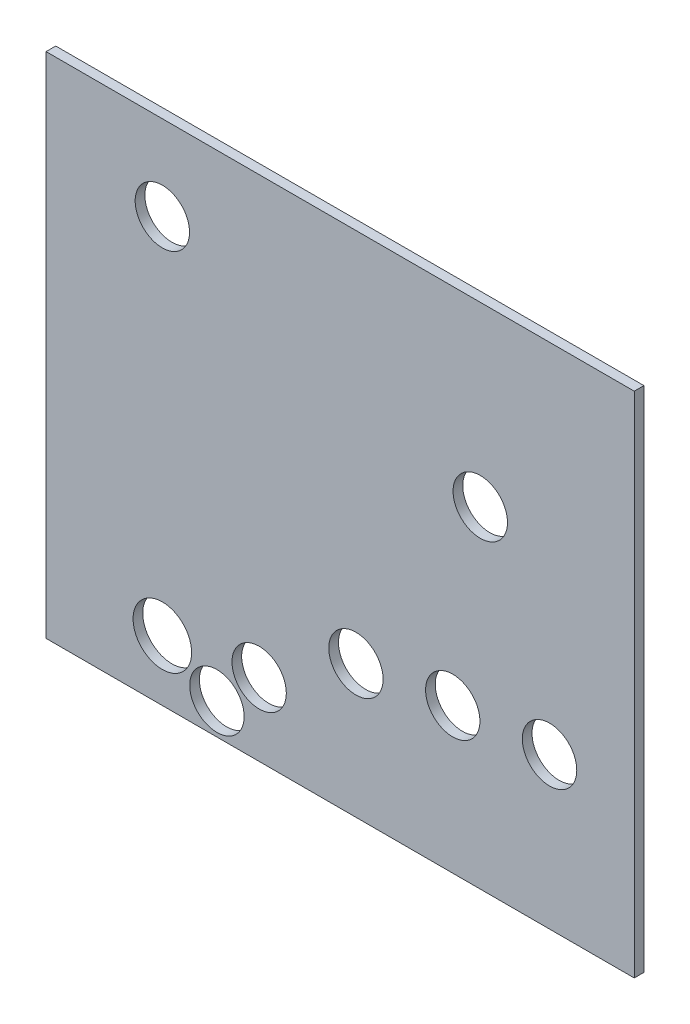
ISO-10303-21;
HEADER;
FILE_DESCRIPTION(('STEP AP214'),'2;1');
FILE_NAME('part.step','',(''),(''),'','','');
FILE_SCHEMA(('AUTOMOTIVE_DESIGN { 1 0 10303 214 1 1 1 1 }'));
ENDSEC;
DATA;
#1=APPLICATION_CONTEXT('core data for automotive mechanical design processes');
#2=APPLICATION_PROTOCOL_DEFINITION('international standard','automotive_design',2000,#1);
#3=PRODUCT_CONTEXT('',#1,'mechanical');
#4=PRODUCT('Part','Part','',(#3));
#5=PRODUCT_RELATED_PRODUCT_CATEGORY('part','',(#4));
#6=PRODUCT_DEFINITION_FORMATION('','',#4);
#7=PRODUCT_DEFINITION_CONTEXT('part definition',#1,'design');
#8=PRODUCT_DEFINITION('design','',#6,#7);
#9=PRODUCT_DEFINITION_SHAPE('','',#8);
#10=(LENGTH_UNIT() NAMED_UNIT(*) SI_UNIT(.MILLI.,.METRE.));
#11=(NAMED_UNIT(*) PLANE_ANGLE_UNIT() SI_UNIT($,.RADIAN.));
#12=(NAMED_UNIT(*) SI_UNIT($,.STERADIAN.) SOLID_ANGLE_UNIT());
#13=UNCERTAINTY_MEASURE_WITH_UNIT(LENGTH_MEASURE(1.E-05),#10,'distance_accuracy_value','');
#14=(GEOMETRIC_REPRESENTATION_CONTEXT(3) GLOBAL_UNCERTAINTY_ASSIGNED_CONTEXT((#13)) GLOBAL_UNIT_ASSIGNED_CONTEXT((#10,
#11,#12)) REPRESENTATION_CONTEXT('',''));
#15=CARTESIAN_POINT('',(0.,0.,0.));
#16=DIRECTION('',(0.,0.,1.));
#17=DIRECTION('',(1.,0.,0.));
#18=AXIS2_PLACEMENT_3D('',#15,#16,#17);
#19=CARTESIAN_POINT('',(0.,-173.714359578953,5.08));
#20=DIRECTION('',(0.,1.,0.));
#21=DIRECTION('',(-1.,0.,0.));
#22=AXIS2_PLACEMENT_3D('',#19,#20,#21);
#23=PLANE('',#22);
#24=DIRECTION('',(1.,0.,0.));
#25=VECTOR('',#24,1.);
#26=CARTESIAN_POINT('',(0.,-173.714359578953,0.));
#27=LINE('',#26,#25);
#28=CARTESIAN_POINT('',(-227.868525816882,-173.714359578953,0.));
#29=VERTEX_POINT('',#28);
#30=CARTESIAN_POINT('',(80.8024486752066,-173.714359578953,0.));
#31=VERTEX_POINT('',#30);
#32=EDGE_CURVE('E131',#29,#31,#27,.T.);
#33=ORIENTED_EDGE('',*,*,#32,.T.);
#34=DIRECTION('',(0.,0.,-1.));
#35=VECTOR('',#34,1.);
#36=CARTESIAN_POINT('',(80.8024486752066,-173.714359578953,5.08));
#37=LINE('',#36,#35);
#38=CARTESIAN_POINT('',(80.8024486752066,-173.714359578953,5.08));
#39=VERTEX_POINT('',#38);
#40=EDGE_CURVE('E11',#39,#31,#37,.T.);
#41=ORIENTED_EDGE('',*,*,#40,.F.);
#42=DIRECTION('',(1.,0.,0.));
#43=VECTOR('',#42,1.);
#44=CARTESIAN_POINT('',(0.,-173.714359578953,5.08));
#45=LINE('',#44,#43);
#46=CARTESIAN_POINT('',(-227.868525816882,-173.714359578953,5.08));
#47=VERTEX_POINT('',#46);
#48=EDGE_CURVE('E95',#47,#39,#45,.T.);
#49=ORIENTED_EDGE('',*,*,#48,.F.);
#50=DIRECTION('',(0.,0.,-1.));
#51=VECTOR('',#50,1.);
#52=CARTESIAN_POINT('',(-227.868525816882,-173.714359578953,5.08));
#53=LINE('',#52,#51);
#54=EDGE_CURVE('E103',#47,#29,#53,.T.);
#55=ORIENTED_EDGE('',*,*,#54,.T.);
#56=EDGE_LOOP('',(#33,#41,#49,#55));
#57=FACE_BOUND('',#56,.T.);
#58=ADVANCED_FACE('F43',(#57),#23,.F.);
#59=CARTESIAN_POINT('',(80.8024486752066,0.,5.08));
#60=DIRECTION('',(-1.,0.,0.));
#61=DIRECTION('',(0.,0.,1.));
#62=AXIS2_PLACEMENT_3D('',#59,#60,#61);
#63=PLANE('',#62);
#64=DIRECTION('',(0.,1.,0.));
#65=VECTOR('',#64,1.);
#66=CARTESIAN_POINT('',(80.8024486752066,0.,0.));
#67=LINE('',#66,#65);
#68=CARTESIAN_POINT('',(80.8024486752066,92.9856404210473,0.));
#69=VERTEX_POINT('',#68);
#70=EDGE_CURVE('E99',#31,#69,#67,.T.);
#71=ORIENTED_EDGE('',*,*,#70,.T.);
#72=DIRECTION('',(0.,0.,-1.));
#73=VECTOR('',#72,1.);
#74=CARTESIAN_POINT('',(80.8024486752066,92.9856404210473,5.08));
#75=LINE('',#74,#73);
#76=CARTESIAN_POINT('',(80.8024486752066,92.9856404210473,5.08));
#77=VERTEX_POINT('',#76);
#78=EDGE_CURVE('E52',#77,#69,#75,.T.);
#79=ORIENTED_EDGE('',*,*,#78,.F.);
#80=DIRECTION('',(0.,1.,0.));
#81=VECTOR('',#80,1.);
#82=CARTESIAN_POINT('',(80.8024486752066,0.,5.08));
#83=LINE('',#82,#81);
#84=EDGE_CURVE('E90',#39,#77,#83,.T.);
#85=ORIENTED_EDGE('',*,*,#84,.F.);
#86=ORIENTED_EDGE('',*,*,#40,.T.);
#87=EDGE_LOOP('',(#71,#79,#85,#86));
#88=FACE_BOUND('',#87,.T.);
#89=ADVANCED_FACE('F98',(#88),#63,.F.);
#90=CARTESIAN_POINT('',(0.,92.9856404210473,5.08));
#91=DIRECTION('',(0.,-1.,0.));
#92=DIRECTION('',(0.,0.,-1.));
#93=AXIS2_PLACEMENT_3D('',#90,#91,#92);
#94=PLANE('',#93);
#95=DIRECTION('',(-1.,0.,0.));
#96=VECTOR('',#95,1.);
#97=CARTESIAN_POINT('',(0.,92.9856404210473,0.));
#98=LINE('',#97,#96);
#99=CARTESIAN_POINT('',(-227.868525816882,92.9856404210473,0.));
#100=VERTEX_POINT('',#99);
#101=EDGE_CURVE('E77',#69,#100,#98,.T.);
#102=ORIENTED_EDGE('',*,*,#101,.T.);
#103=DIRECTION('',(0.,0.,-1.));
#104=VECTOR('',#103,1.);
#105=CARTESIAN_POINT('',(-227.868525816882,92.9856404210473,5.08));
#106=LINE('',#105,#104);
#107=CARTESIAN_POINT('',(-227.868525816882,92.9856404210473,5.08));
#108=VERTEX_POINT('',#107);
#109=EDGE_CURVE('E100',#108,#100,#106,.T.);
#110=ORIENTED_EDGE('',*,*,#109,.F.);
#111=DIRECTION('',(-1.,0.,0.));
#112=VECTOR('',#111,1.);
#113=CARTESIAN_POINT('',(0.,92.9856404210473,5.08));
#114=LINE('',#113,#112);
#115=EDGE_CURVE('E93',#77,#108,#114,.T.);
#116=ORIENTED_EDGE('',*,*,#115,.F.);
#117=ORIENTED_EDGE('',*,*,#78,.T.);
#118=EDGE_LOOP('',(#102,#110,#116,#117));
#119=FACE_BOUND('',#118,.T.);
#120=ADVANCED_FACE('F101',(#119),#94,.F.);
#121=CARTESIAN_POINT('',(0.,0.,5.08));
#122=DIRECTION('',(0.,0.,-1.));
#123=DIRECTION('',(-1.,0.,0.));
#124=AXIS2_PLACEMENT_3D('',#121,#122,#123);
#125=CYLINDRICAL_SURFACE('',#124,14.2875);
#126=CARTESIAN_POINT('',(0.,0.,5.08));
#127=DIRECTION('',(0.,0.,1.));
#128=DIRECTION('',(1.,0.,0.));
#129=AXIS2_PLACEMENT_3D('',#126,#127,#128);
#130=CIRCLE('',#129,14.2875);
#131=CARTESIAN_POINT('',(14.2875,0.,5.08));
#132=VERTEX_POINT('',#131);
#133=EDGE_CURVE('E144',#132,#132,#130,.T.);
#134=ORIENTED_EDGE('',*,*,#133,.T.);
#135=EDGE_LOOP('',(#134));
#136=FACE_BOUND('',#135,.T.);
#137=CARTESIAN_POINT('',(0.,0.,0.));
#138=DIRECTION('',(0.,0.,1.));
#139=DIRECTION('',(1.,0.,0.));
#140=AXIS2_PLACEMENT_3D('',#137,#138,#139);
#141=CIRCLE('',#140,14.2875);
#142=CARTESIAN_POINT('',(14.2875,0.,0.));
#143=VERTEX_POINT('',#142);
#144=EDGE_CURVE('E128',#143,#143,#141,.T.);
#145=ORIENTED_EDGE('',*,*,#144,.F.);
#146=EDGE_LOOP('',(#145));
#147=FACE_BOUND('',#146,.T.);
#148=ADVANCED_FACE('F188',(#136,#147),#125,.F.);
#149=CARTESIAN_POINT('',(-138.20185945543,-157.325049094457,5.08));
#150=DIRECTION('',(0.,0.,-1.));
#151=DIRECTION('',(-1.,0.,0.));
#152=AXIS2_PLACEMENT_3D('',#149,#150,#151);
#153=CYLINDRICAL_SURFACE('',#152,14.2875);
#154=CARTESIAN_POINT('',(-138.20185945543,-157.325049094457,5.08));
#155=DIRECTION('',(0.,0.,1.));
#156=DIRECTION('',(1.,0.,0.));
#157=AXIS2_PLACEMENT_3D('',#154,#155,#156);
#158=CIRCLE('',#157,14.2875);
#159=CARTESIAN_POINT('',(-123.91435945543,-157.325049094457,5.08));
#160=VERTEX_POINT('',#159);
#161=EDGE_CURVE('E146',#160,#160,#158,.T.);
#162=ORIENTED_EDGE('',*,*,#161,.T.);
#163=EDGE_LOOP('',(#162));
#164=FACE_BOUND('',#163,.T.);
#165=CARTESIAN_POINT('',(-138.20185945543,-157.325049094457,0.));
#166=DIRECTION('',(0.,0.,1.));
#167=DIRECTION('',(1.,0.,0.));
#168=AXIS2_PLACEMENT_3D('',#165,#166,#167);
#169=CIRCLE('',#168,14.2875);
#170=CARTESIAN_POINT('',(-123.91435945543,-157.325049094457,0.));
#171=VERTEX_POINT('',#170);
#172=EDGE_CURVE('E125',#171,#171,#169,.T.);
#173=ORIENTED_EDGE('',*,*,#172,.F.);
#174=EDGE_LOOP('',(#173));
#175=FACE_BOUND('',#174,.T.);
#176=ADVANCED_FACE('F191',(#164,#175),#153,.F.);
#177=CARTESIAN_POINT('',(-166.847551324245,48.5356404208762,5.08));
#178=DIRECTION('',(0.,0.,-1.));
#179=DIRECTION('',(-1.,0.,0.));
#180=AXIS2_PLACEMENT_3D('',#177,#178,#179);
#181=CYLINDRICAL_SURFACE('',#180,14.2621000003079);
#182=CARTESIAN_POINT('',(-166.847551324245,48.5356404208762,5.08));
#183=DIRECTION('',(0.,0.,1.));
#184=DIRECTION('',(1.,0.,0.));
#185=AXIS2_PLACEMENT_3D('',#182,#183,#184);
#186=CIRCLE('',#185,14.2621000003079);
#187=CARTESIAN_POINT('',(-152.585451323937,48.5356404208762,5.08));
#188=VERTEX_POINT('',#187);
#189=EDGE_CURVE('E151',#188,#188,#186,.T.);
#190=ORIENTED_EDGE('',*,*,#189,.T.);
#191=EDGE_LOOP('',(#190));
#192=FACE_BOUND('',#191,.T.);
#193=CARTESIAN_POINT('',(-166.847551324245,48.5356404208762,0.));
#194=DIRECTION('',(0.,0.,1.));
#195=DIRECTION('',(1.,0.,0.));
#196=AXIS2_PLACEMENT_3D('',#193,#194,#195);
#197=CIRCLE('',#196,14.2621000003079);
#198=CARTESIAN_POINT('',(-152.585451323937,48.5356404208762,0.));
#199=VERTEX_POINT('',#198);
#200=EDGE_CURVE('E122',#199,#199,#197,.T.);
#201=ORIENTED_EDGE('',*,*,#200,.F.);
#202=EDGE_LOOP('',(#201));
#203=FACE_BOUND('',#202,.T.);
#204=ADVANCED_FACE('F212',(#192,#203),#181,.F.);
#205=CARTESIAN_POINT('',(-166.847551324439,-141.964359578953,5.08));
#206=DIRECTION('',(0.,0.,-1.));
#207=DIRECTION('',(-1.,0.,0.));
#208=AXIS2_PLACEMENT_3D('',#205,#206,#207);
#209=CYLINDRICAL_SURFACE('',#208,15.365901375561);
#210=CARTESIAN_POINT('',(-166.847551324439,-141.964359578953,5.08));
#211=DIRECTION('',(0.,0.,1.));
#212=DIRECTION('',(1.,0.,0.));
#213=AXIS2_PLACEMENT_3D('',#210,#211,#212);
#214=CIRCLE('',#213,15.365901375561);
#215=CARTESIAN_POINT('',(-151.481649948878,-141.964359578953,5.08));
#216=VERTEX_POINT('',#215);
#217=EDGE_CURVE('E154',#216,#216,#214,.T.);
#218=ORIENTED_EDGE('',*,*,#217,.T.);
#219=EDGE_LOOP('',(#218));
#220=FACE_BOUND('',#219,.T.);
#221=CARTESIAN_POINT('',(-166.847551324439,-141.964359578953,0.));
#222=DIRECTION('',(0.,0.,1.));
#223=DIRECTION('',(1.,0.,0.));
#224=AXIS2_PLACEMENT_3D('',#221,#222,#223);
#225=CIRCLE('',#224,15.365901375561);
#226=CARTESIAN_POINT('',(-151.481649948878,-141.964359578953,0.));
#227=VERTEX_POINT('',#226);
#228=EDGE_CURVE('E119',#227,#227,#225,.T.);
#229=ORIENTED_EDGE('',*,*,#228,.F.);
#230=EDGE_LOOP('',(#229));
#231=FACE_BOUND('',#230,.T.);
#232=ADVANCED_FACE('F216',(#220,#231),#209,.F.);
#233=CARTESIAN_POINT('',(-116.047551324426,-135.614359579057,5.08));
#234=DIRECTION('',(0.,0.,-1.));
#235=DIRECTION('',(-1.,0.,0.));
#236=AXIS2_PLACEMENT_3D('',#233,#234,#235);
#237=CYLINDRICAL_SURFACE('',#236,14.262100000127);
#238=CARTESIAN_POINT('',(-116.047551324426,-135.614359579057,5.08));
#239=DIRECTION('',(0.,0.,1.));
#240=DIRECTION('',(1.,0.,0.));
#241=AXIS2_PLACEMENT_3D('',#238,#239,#240);
#242=CIRCLE('',#241,14.262100000127);
#243=CARTESIAN_POINT('',(-101.785451324299,-135.614359579057,5.08));
#244=VERTEX_POINT('',#243);
#245=EDGE_CURVE('E157',#244,#244,#242,.T.);
#246=ORIENTED_EDGE('',*,*,#245,.T.);
#247=EDGE_LOOP('',(#246));
#248=FACE_BOUND('',#247,.T.);
#249=CARTESIAN_POINT('',(-116.047551324426,-135.614359579057,0.));
#250=DIRECTION('',(0.,0.,1.));
#251=DIRECTION('',(1.,0.,0.));
#252=AXIS2_PLACEMENT_3D('',#249,#250,#251);
#253=CIRCLE('',#252,14.262100000127);
#254=CARTESIAN_POINT('',(-101.785451324299,-135.614359579057,0.));
#255=VERTEX_POINT('',#254);
#256=EDGE_CURVE('E116',#255,#255,#253,.T.);
#257=ORIENTED_EDGE('',*,*,#256,.F.);
#258=EDGE_LOOP('',(#257));
#259=FACE_BOUND('',#258,.T.);
#260=ADVANCED_FACE('F220',(#248,#259),#237,.F.);
#261=CARTESIAN_POINT('',(-65.2475513245231,-103.864359579092,5.08));
#262=DIRECTION('',(0.,0.,-1.));
#263=DIRECTION('',(-1.,0.,0.));
#264=AXIS2_PLACEMENT_3D('',#261,#262,#263);
#265=CYLINDRICAL_SURFACE('',#264,14.2621000000297);
#266=CARTESIAN_POINT('',(-65.2475513245231,-103.864359579092,5.08));
#267=DIRECTION('',(0.,0.,1.));
#268=DIRECTION('',(1.,0.,0.));
#269=AXIS2_PLACEMENT_3D('',#266,#267,#268);
#270=CIRCLE('',#269,14.2621000000297);
#271=CARTESIAN_POINT('',(-50.9854513244933,-103.864359579092,5.08));
#272=VERTEX_POINT('',#271);
#273=EDGE_CURVE('E160',#272,#272,#270,.T.);
#274=ORIENTED_EDGE('',*,*,#273,.T.);
#275=EDGE_LOOP('',(#274));
#276=FACE_BOUND('',#275,.T.);
#277=CARTESIAN_POINT('',(-65.2475513245231,-103.864359579092,0.));
#278=DIRECTION('',(0.,0.,1.));
#279=DIRECTION('',(1.,0.,0.));
#280=AXIS2_PLACEMENT_3D('',#277,#278,#279);
#281=CIRCLE('',#280,14.2621000000297);
#282=CARTESIAN_POINT('',(-50.9854513244933,-103.864359579092,0.));
#283=VERTEX_POINT('',#282);
#284=EDGE_CURVE('E113',#283,#283,#281,.T.);
#285=ORIENTED_EDGE('',*,*,#284,.F.);
#286=EDGE_LOOP('',(#285));
#287=FACE_BOUND('',#286,.T.);
#288=ADVANCED_FACE('F224',(#276,#287),#265,.F.);
#289=CARTESIAN_POINT('',(-14.4475513245528,-97.5143595788538,5.08));
#290=DIRECTION('',(0.,0.,-1.));
#291=DIRECTION('',(-1.,0.,0.));
#292=AXIS2_PLACEMENT_3D('',#289,#290,#291);
#293=CYLINDRICAL_SURFACE('',#292,14.2621);
#294=CARTESIAN_POINT('',(-14.4475513245528,-97.5143595788538,5.08));
#295=DIRECTION('',(0.,0.,1.));
#296=DIRECTION('',(1.,0.,0.));
#297=AXIS2_PLACEMENT_3D('',#294,#295,#296);
#298=CIRCLE('',#297,14.2621);
#299=CARTESIAN_POINT('',(-0.185451324552794,-97.5143595788538,5.08));
#300=VERTEX_POINT('',#299);
#301=EDGE_CURVE('E163',#300,#300,#298,.T.);
#302=ORIENTED_EDGE('',*,*,#301,.T.);
#303=EDGE_LOOP('',(#302));
#304=FACE_BOUND('',#303,.T.);
#305=CARTESIAN_POINT('',(-14.4475513245528,-97.5143595788538,0.));
#306=DIRECTION('',(0.,0.,1.));
#307=DIRECTION('',(1.,0.,0.));
#308=AXIS2_PLACEMENT_3D('',#305,#306,#307);
#309=CIRCLE('',#308,14.2621);
#310=CARTESIAN_POINT('',(-0.185451324552794,-97.5143595788538,0.));
#311=VERTEX_POINT('',#310);
#312=EDGE_CURVE('E110',#311,#311,#309,.T.);
#313=ORIENTED_EDGE('',*,*,#312,.F.);
#314=EDGE_LOOP('',(#313));
#315=FACE_BOUND('',#314,.T.);
#316=ADVANCED_FACE('F227',(#304,#315),#293,.F.);
#317=CARTESIAN_POINT('',(36.3524486754472,-94.3893206007822,5.08));
#318=DIRECTION('',(0.,0.,-1.));
#319=DIRECTION('',(-1.,0.,0.));
#320=AXIS2_PLACEMENT_3D('',#317,#318,#319);
#321=CYLINDRICAL_SURFACE('',#320,14.2875);
#322=CARTESIAN_POINT('',(36.3524486754472,-94.3893206007822,5.08));
#323=DIRECTION('',(0.,0.,1.));
#324=DIRECTION('',(1.,0.,0.));
#325=AXIS2_PLACEMENT_3D('',#322,#323,#324);
#326=CIRCLE('',#325,14.2875);
#327=CARTESIAN_POINT('',(50.6399486754472,-94.3893206007822,5.08));
#328=VERTEX_POINT('',#327);
#329=EDGE_CURVE('E137',#328,#328,#326,.T.);
#330=ORIENTED_EDGE('',*,*,#329,.T.);
#331=EDGE_LOOP('',(#330));
#332=FACE_BOUND('',#331,.T.);
#333=CARTESIAN_POINT('',(36.3524486754472,-94.3893206007822,0.));
#334=DIRECTION('',(0.,0.,1.));
#335=DIRECTION('',(1.,0.,0.));
#336=AXIS2_PLACEMENT_3D('',#333,#334,#335);
#337=CIRCLE('',#336,14.2875);
#338=CARTESIAN_POINT('',(50.6399486754472,-94.3893206007822,0.));
#339=VERTEX_POINT('',#338);
#340=EDGE_CURVE('E107',#339,#339,#337,.T.);
#341=ORIENTED_EDGE('',*,*,#340,.F.);
#342=EDGE_LOOP('',(#341));
#343=FACE_BOUND('',#342,.T.);
#344=ADVANCED_FACE('F45',(#332,#343),#321,.F.);
#345=CARTESIAN_POINT('',(-227.868525816882,0.,5.08));
#346=DIRECTION('',(1.,0.,0.));
#347=DIRECTION('',(0.,0.,-1.));
#348=AXIS2_PLACEMENT_3D('',#345,#346,#347);
#349=PLANE('',#348);
#350=DIRECTION('',(0.,-1.,0.));
#351=VECTOR('',#350,1.);
#352=CARTESIAN_POINT('',(-227.868525816882,0.,0.));
#353=LINE('',#352,#351);
#354=EDGE_CURVE('E83',#100,#29,#353,.T.);
#355=ORIENTED_EDGE('',*,*,#354,.T.);
#356=ORIENTED_EDGE('',*,*,#54,.F.);
#357=DIRECTION('',(0.,-1.,0.));
#358=VECTOR('',#357,1.);
#359=CARTESIAN_POINT('',(-227.868525816882,0.,5.08));
#360=LINE('',#359,#358);
#361=EDGE_CURVE('E60',#108,#47,#360,.T.);
#362=ORIENTED_EDGE('',*,*,#361,.F.);
#363=ORIENTED_EDGE('',*,*,#109,.T.);
#364=EDGE_LOOP('',(#355,#356,#362,#363));
#365=FACE_BOUND('',#364,.T.);
#366=ADVANCED_FACE('F139',(#365),#349,.F.);
#367=CARTESIAN_POINT('',(0.,0.,5.08));
#368=DIRECTION('',(0.,0.,1.));
#369=DIRECTION('',(1.,0.,0.));
#370=AXIS2_PLACEMENT_3D('',#367,#368,#369);
#371=PLANE('',#370);
#372=ORIENTED_EDGE('',*,*,#329,.F.);
#373=EDGE_LOOP('',(#372));
#374=FACE_BOUND('',#373,.T.);
#375=ORIENTED_EDGE('',*,*,#301,.F.);
#376=EDGE_LOOP('',(#375));
#377=FACE_BOUND('',#376,.T.);
#378=ORIENTED_EDGE('',*,*,#273,.F.);
#379=EDGE_LOOP('',(#378));
#380=FACE_BOUND('',#379,.T.);
#381=ORIENTED_EDGE('',*,*,#245,.F.);
#382=EDGE_LOOP('',(#381));
#383=FACE_BOUND('',#382,.T.);
#384=ORIENTED_EDGE('',*,*,#217,.F.);
#385=EDGE_LOOP('',(#384));
#386=FACE_BOUND('',#385,.T.);
#387=ORIENTED_EDGE('',*,*,#189,.F.);
#388=EDGE_LOOP('',(#387));
#389=FACE_BOUND('',#388,.T.);
#390=ORIENTED_EDGE('',*,*,#161,.F.);
#391=EDGE_LOOP('',(#390));
#392=FACE_BOUND('',#391,.T.);
#393=ORIENTED_EDGE('',*,*,#133,.F.);
#394=EDGE_LOOP('',(#393));
#395=FACE_BOUND('',#394,.T.);
#396=ORIENTED_EDGE('',*,*,#48,.T.);
#397=ORIENTED_EDGE('',*,*,#84,.T.);
#398=ORIENTED_EDGE('',*,*,#115,.T.);
#399=ORIENTED_EDGE('',*,*,#361,.T.);
#400=EDGE_LOOP('',(#396,#397,#398,#399));
#401=FACE_BOUND('',#400,.T.);
#402=ADVANCED_FACE('F91',(#374,#377,#380,#383,#386,#389,#392,#395,#401),#371,.T.);
#403=CARTESIAN_POINT('',(0.,0.,0.));
#404=DIRECTION('',(0.,0.,1.));
#405=DIRECTION('',(1.,0.,0.));
#406=AXIS2_PLACEMENT_3D('',#403,#404,#405);
#407=PLANE('',#406);
#408=ORIENTED_EDGE('',*,*,#340,.T.);
#409=EDGE_LOOP('',(#408));
#410=FACE_BOUND('',#409,.T.);
#411=ORIENTED_EDGE('',*,*,#312,.T.);
#412=EDGE_LOOP('',(#411));
#413=FACE_BOUND('',#412,.T.);
#414=ORIENTED_EDGE('',*,*,#284,.T.);
#415=EDGE_LOOP('',(#414));
#416=FACE_BOUND('',#415,.T.);
#417=ORIENTED_EDGE('',*,*,#256,.T.);
#418=EDGE_LOOP('',(#417));
#419=FACE_BOUND('',#418,.T.);
#420=ORIENTED_EDGE('',*,*,#228,.T.);
#421=EDGE_LOOP('',(#420));
#422=FACE_BOUND('',#421,.T.);
#423=ORIENTED_EDGE('',*,*,#200,.T.);
#424=EDGE_LOOP('',(#423));
#425=FACE_BOUND('',#424,.T.);
#426=ORIENTED_EDGE('',*,*,#172,.T.);
#427=EDGE_LOOP('',(#426));
#428=FACE_BOUND('',#427,.T.);
#429=ORIENTED_EDGE('',*,*,#144,.T.);
#430=EDGE_LOOP('',(#429));
#431=FACE_BOUND('',#430,.T.);
#432=ORIENTED_EDGE('',*,*,#32,.F.);
#433=ORIENTED_EDGE('',*,*,#354,.F.);
#434=ORIENTED_EDGE('',*,*,#101,.F.);
#435=ORIENTED_EDGE('',*,*,#70,.F.);
#436=EDGE_LOOP('',(#432,#433,#434,#435));
#437=FACE_BOUND('',#436,.T.);
#438=ADVANCED_FACE('F142',(#410,#413,#416,#419,#422,#425,#428,#431,#437),#407,.F.);
#439=CLOSED_SHELL('',(#58,#89,#120,#148,#176,#204,#232,#260,#288,#316,#344,#366,#402,#438));
#440=MANIFOLD_SOLID_BREP('B2',#439);
#441=ADVANCED_BREP_SHAPE_REPRESENTATION('',(#18,#440),#14);
#442=SHAPE_DEFINITION_REPRESENTATION(#9,#441);
ENDSEC;
END-ISO-10303-21;
